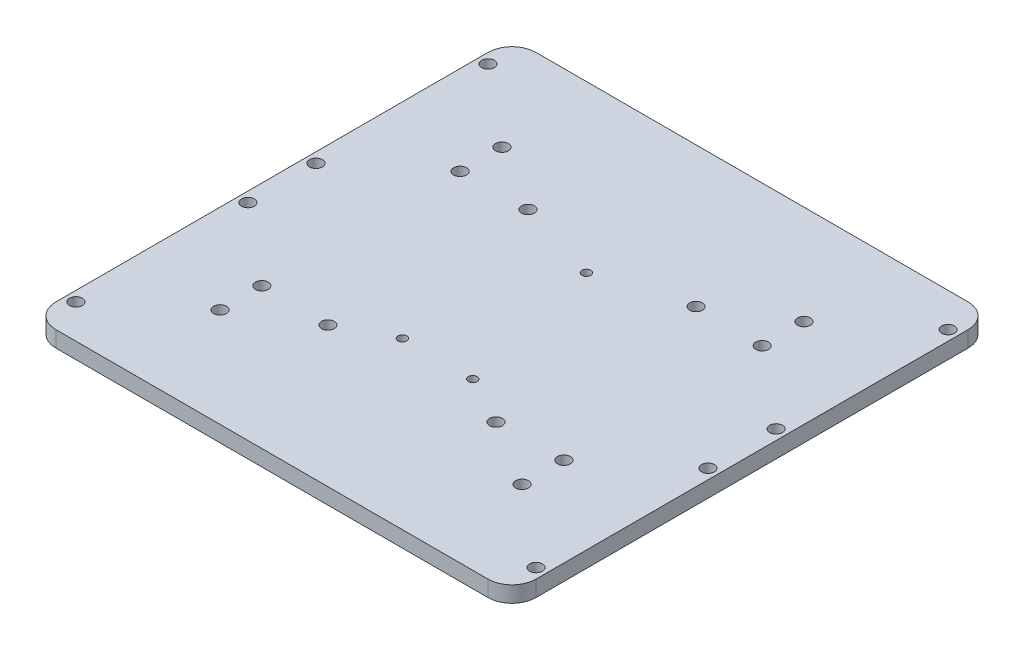
ISO-10303-21;
HEADER;
FILE_DESCRIPTION(('STEP AP214'),'2;1');
FILE_NAME('part.step','',(''),(''),'','','');
FILE_SCHEMA(('AUTOMOTIVE_DESIGN { 1 0 10303 214 1 1 1 1 }'));
ENDSEC;
DATA;
#1=APPLICATION_CONTEXT('core data for automotive mechanical design processes');
#2=APPLICATION_PROTOCOL_DEFINITION('international standard','automotive_design',2000,#1);
#3=PRODUCT_CONTEXT('',#1,'mechanical');
#4=PRODUCT('Part','Part','',(#3));
#5=PRODUCT_RELATED_PRODUCT_CATEGORY('part','',(#4));
#6=PRODUCT_DEFINITION_FORMATION('','',#4);
#7=PRODUCT_DEFINITION_CONTEXT('part definition',#1,'design');
#8=PRODUCT_DEFINITION('design','',#6,#7);
#9=PRODUCT_DEFINITION_SHAPE('','',#8);
#10=(LENGTH_UNIT() NAMED_UNIT(*) SI_UNIT(.MILLI.,.METRE.));
#11=(NAMED_UNIT(*) PLANE_ANGLE_UNIT() SI_UNIT($,.RADIAN.));
#12=(NAMED_UNIT(*) SI_UNIT($,.STERADIAN.) SOLID_ANGLE_UNIT());
#13=UNCERTAINTY_MEASURE_WITH_UNIT(LENGTH_MEASURE(1.E-05),#10,'distance_accuracy_value','');
#14=(GEOMETRIC_REPRESENTATION_CONTEXT(3) GLOBAL_UNCERTAINTY_ASSIGNED_CONTEXT((#13)) GLOBAL_UNIT_ASSIGNED_CONTEXT((#10,
#11,#12)) REPRESENTATION_CONTEXT('',''));
#15=CARTESIAN_POINT('',(0.,0.,0.));
#16=DIRECTION('',(0.,0.,1.));
#17=DIRECTION('',(1.,0.,0.));
#18=AXIS2_PLACEMENT_3D('',#15,#16,#17);
#19=CARTESIAN_POINT('',(-54.,4.,54.));
#20=DIRECTION('',(0.,1.,0.));
#21=DIRECTION('',(0.,0.,1.));
#22=AXIS2_PLACEMENT_3D('',#19,#20,#21);
#23=PLANE('',#22);
#24=CARTESIAN_POINT('',(21.,4.,25.));
#25=DIRECTION('',(0.,1.,0.));
#26=DIRECTION('',(0.,0.,1.));
#27=AXIS2_PLACEMENT_3D('',#24,#25,#26);
#28=CIRCLE('',#27,1.6);
#29=CARTESIAN_POINT('',(21.,4.,26.6));
#30=VERTEX_POINT('',#29);
#31=EDGE_CURVE('E373',#30,#30,#28,.T.);
#32=ORIENTED_EDGE('',*,*,#31,.F.);
#33=EDGE_LOOP('',(#32));
#34=FACE_BOUND('',#33,.T.);
#35=CARTESIAN_POINT('',(-21.,4.,-25.));
#36=DIRECTION('',(0.,1.,0.));
#37=DIRECTION('',(0.,0.,1.));
#38=AXIS2_PLACEMENT_3D('',#35,#36,#37);
#39=CIRCLE('',#38,1.6);
#40=CARTESIAN_POINT('',(-21.,4.,-23.4));
#41=VERTEX_POINT('',#40);
#42=EDGE_CURVE('E357',#41,#41,#39,.T.);
#43=ORIENTED_EDGE('',*,*,#42,.F.);
#44=EDGE_LOOP('',(#43));
#45=FACE_BOUND('',#44,.T.);
#46=CARTESIAN_POINT('',(8.8,4.,18.6));
#47=DIRECTION('',(0.,1.,0.));
#48=DIRECTION('',(0.,0.,1.));
#49=AXIS2_PLACEMENT_3D('',#46,#47,#48);
#50=CIRCLE('',#49,1.1);
#51=CARTESIAN_POINT('',(8.8,4.,19.7));
#52=VERTEX_POINT('',#51);
#53=EDGE_CURVE('E341',#52,#52,#50,.T.);
#54=ORIENTED_EDGE('',*,*,#53,.F.);
#55=EDGE_LOOP('',(#54));
#56=FACE_BOUND('',#55,.T.);
#57=CARTESIAN_POINT('',(57.5,4.,-51.5));
#58=DIRECTION('',(0.,1.,0.));
#59=DIRECTION('',(0.,0.,-1.));
#60=AXIS2_PLACEMENT_3D('',#57,#58,#59);
#61=CIRCLE('',#60,1.6);
#62=CARTESIAN_POINT('',(57.5,4.,-53.1));
#63=VERTEX_POINT('',#62);
#64=EDGE_CURVE('E325',#63,#63,#61,.T.);
#65=ORIENTED_EDGE('',*,*,#64,.F.);
#66=EDGE_LOOP('',(#65));
#67=FACE_BOUND('',#66,.T.);
#68=CARTESIAN_POINT('',(37.75,4.,-24.77));
#69=DIRECTION('',(0.,1.,0.));
#70=DIRECTION('',(0.,0.,1.));
#71=AXIS2_PLACEMENT_3D('',#68,#69,#70);
#72=CIRCLE('',#71,1.6);
#73=CARTESIAN_POINT('',(37.75,4.,-23.17));
#74=VERTEX_POINT('',#73);
#75=EDGE_CURVE('E309',#74,#74,#72,.T.);
#76=ORIENTED_EDGE('',*,*,#75,.F.);
#77=EDGE_LOOP('',(#76));
#78=FACE_BOUND('',#77,.T.);
#79=CARTESIAN_POINT('',(57.5,4.,8.50000000000001));
#80=DIRECTION('',(0.,1.,0.));
#81=DIRECTION('',(0.,0.,-1.));
#82=AXIS2_PLACEMENT_3D('',#79,#80,#81);
#83=CIRCLE('',#82,1.6);
#84=CARTESIAN_POINT('',(57.5,4.,6.90000000000001));
#85=VERTEX_POINT('',#84);
#86=EDGE_CURVE('E293',#85,#85,#83,.T.);
#87=ORIENTED_EDGE('',*,*,#86,.F.);
#88=EDGE_LOOP('',(#87));
#89=FACE_BOUND('',#88,.T.);
#90=CARTESIAN_POINT('',(37.75,4.,35.23));
#91=DIRECTION('',(0.,1.,0.));
#92=DIRECTION('',(0.,0.,1.));
#93=AXIS2_PLACEMENT_3D('',#90,#91,#92);
#94=CIRCLE('',#93,1.6);
#95=CARTESIAN_POINT('',(37.75,4.,36.83));
#96=VERTEX_POINT('',#95);
#97=EDGE_CURVE('E277',#96,#96,#94,.T.);
#98=ORIENTED_EDGE('',*,*,#97,.F.);
#99=EDGE_LOOP('',(#98));
#100=FACE_BOUND('',#99,.T.);
#101=CARTESIAN_POINT('',(-57.5,4.,51.5));
#102=DIRECTION('',(0.,1.,0.));
#103=DIRECTION('',(0.,0.,-1.));
#104=AXIS2_PLACEMENT_3D('',#101,#102,#103);
#105=CIRCLE('',#104,1.6);
#106=CARTESIAN_POINT('',(-57.5,4.,49.9));
#107=VERTEX_POINT('',#106);
#108=EDGE_CURVE('E261',#107,#107,#105,.T.);
#109=ORIENTED_EDGE('',*,*,#108,.F.);
#110=EDGE_LOOP('',(#109));
#111=FACE_BOUND('',#110,.T.);
#112=CARTESIAN_POINT('',(-37.75,4.,24.77));
#113=DIRECTION('',(0.,1.,0.));
#114=DIRECTION('',(0.,0.,1.));
#115=AXIS2_PLACEMENT_3D('',#112,#113,#114);
#116=CIRCLE('',#115,1.6);
#117=CARTESIAN_POINT('',(-37.75,4.,26.37));
#118=VERTEX_POINT('',#117);
#119=EDGE_CURVE('E245',#118,#118,#116,.T.);
#120=ORIENTED_EDGE('',*,*,#119,.F.);
#121=EDGE_LOOP('',(#120));
#122=FACE_BOUND('',#121,.T.);
#123=CARTESIAN_POINT('',(-37.75,4.,-24.77));
#124=DIRECTION('',(0.,1.,0.));
#125=DIRECTION('',(0.,0.,-1.));
#126=AXIS2_PLACEMENT_3D('',#123,#124,#125);
#127=CIRCLE('',#126,1.6);
#128=CARTESIAN_POINT('',(-37.75,4.,-26.37));
#129=VERTEX_POINT('',#128);
#130=EDGE_CURVE('E229',#129,#129,#127,.T.);
#131=ORIENTED_EDGE('',*,*,#130,.F.);
#132=EDGE_LOOP('',(#131));
#133=FACE_BOUND('',#132,.T.);
#134=CARTESIAN_POINT('',(-57.5,4.,-8.49999999999999));
#135=DIRECTION('',(0.,1.,0.));
#136=DIRECTION('',(0.,0.,-1.));
#137=AXIS2_PLACEMENT_3D('',#134,#135,#136);
#138=CIRCLE('',#137,1.6);
#139=CARTESIAN_POINT('',(-57.5,4.,-10.1));
#140=VERTEX_POINT('',#139);
#141=EDGE_CURVE('E213',#140,#140,#138,.T.);
#142=ORIENTED_EDGE('',*,*,#141,.F.);
#143=EDGE_LOOP('',(#142));
#144=FACE_BOUND('',#143,.T.);
#145=CARTESIAN_POINT('',(-54.,4.,54.));
#146=DIRECTION('',(0.,1.,0.));
#147=DIRECTION('',(0.,0.,1.));
#148=AXIS2_PLACEMENT_3D('',#145,#146,#147);
#149=CIRCLE('',#148,6.);
#150=CARTESIAN_POINT('',(-60.,4.,53.9999999999999));
#151=VERTEX_POINT('',#150);
#152=CARTESIAN_POINT('',(-54.,4.,60.));
#153=VERTEX_POINT('',#152);
#154=EDGE_CURVE('E164',#151,#153,#149,.T.);
#155=ORIENTED_EDGE('',*,*,#154,.T.);
#156=DIRECTION('',(1.,0.,0.));
#157=VECTOR('',#156,1.);
#158=CARTESIAN_POINT('',(-54.,4.,60.));
#159=LINE('',#158,#157);
#160=CARTESIAN_POINT('',(54.,4.,60.));
#161=VERTEX_POINT('',#160);
#162=EDGE_CURVE('E100',#153,#161,#159,.T.);
#163=ORIENTED_EDGE('',*,*,#162,.T.);
#164=CARTESIAN_POINT('',(54.,4.,54.));
#165=DIRECTION('',(0.,1.,0.));
#166=DIRECTION('',(0.,0.,1.));
#167=AXIS2_PLACEMENT_3D('',#164,#165,#166);
#168=CIRCLE('',#167,6.);
#169=CARTESIAN_POINT('',(60.,4.,53.9999999999999));
#170=VERTEX_POINT('',#169);
#171=EDGE_CURVE('E185',#161,#170,#168,.T.);
#172=ORIENTED_EDGE('',*,*,#171,.T.);
#173=DIRECTION('',(0.,0.,-1.));
#174=VECTOR('',#173,1.);
#175=CARTESIAN_POINT('',(60.,4.,-54.));
#176=LINE('',#175,#174);
#177=CARTESIAN_POINT('',(60.,4.,-54.));
#178=VERTEX_POINT('',#177);
#179=EDGE_CURVE('E199',#170,#178,#176,.T.);
#180=ORIENTED_EDGE('',*,*,#179,.T.);
#181=CARTESIAN_POINT('',(54.,4.,-54.));
#182=DIRECTION('',(0.,1.,0.));
#183=DIRECTION('',(0.,0.,-1.));
#184=AXIS2_PLACEMENT_3D('',#181,#182,#183);
#185=CIRCLE('',#184,6.);
#186=CARTESIAN_POINT('',(53.9999999999999,4.,-60.));
#187=VERTEX_POINT('',#186);
#188=EDGE_CURVE('E119',#178,#187,#185,.T.);
#189=ORIENTED_EDGE('',*,*,#188,.T.);
#190=DIRECTION('',(-1.,0.,0.));
#191=VECTOR('',#190,1.);
#192=CARTESIAN_POINT('',(-54.,4.,-60.));
#193=LINE('',#192,#191);
#194=CARTESIAN_POINT('',(-54.,4.,-60.));
#195=VERTEX_POINT('',#194);
#196=EDGE_CURVE('E113',#187,#195,#193,.T.);
#197=ORIENTED_EDGE('',*,*,#196,.T.);
#198=CARTESIAN_POINT('',(-54.,4.,-54.));
#199=DIRECTION('',(0.,1.,0.));
#200=DIRECTION('',(0.,0.,1.));
#201=AXIS2_PLACEMENT_3D('',#198,#199,#200);
#202=CIRCLE('',#201,6.);
#203=CARTESIAN_POINT('',(-60.,4.,-54.));
#204=VERTEX_POINT('',#203);
#205=EDGE_CURVE('E117',#195,#204,#202,.T.);
#206=ORIENTED_EDGE('',*,*,#205,.T.);
#207=DIRECTION('',(0.,0.,1.));
#208=VECTOR('',#207,1.);
#209=CARTESIAN_POINT('',(-60.,4.,-54.));
#210=LINE('',#209,#208);
#211=EDGE_CURVE('E57',#204,#151,#210,.T.);
#212=ORIENTED_EDGE('',*,*,#211,.T.);
#213=EDGE_LOOP('',(#155,#163,#172,#180,#189,#197,#206,#212));
#214=FACE_BOUND('',#213,.T.);
#215=CARTESIAN_POINT('',(-57.5,4.,-51.5));
#216=DIRECTION('',(0.,1.,0.));
#217=DIRECTION('',(0.,0.,1.));
#218=AXIS2_PLACEMENT_3D('',#215,#216,#217);
#219=CIRCLE('',#218,1.6);
#220=CARTESIAN_POINT('',(-57.5,4.,-49.9));
#221=VERTEX_POINT('',#220);
#222=EDGE_CURVE('E146',#221,#221,#219,.T.);
#223=ORIENTED_EDGE('',*,*,#222,.F.);
#224=EDGE_LOOP('',(#223));
#225=FACE_BOUND('',#224,.T.);
#226=CARTESIAN_POINT('',(-37.75,4.,-35.23));
#227=DIRECTION('',(0.,1.,0.));
#228=DIRECTION('',(0.,0.,1.));
#229=AXIS2_PLACEMENT_3D('',#226,#227,#228);
#230=CIRCLE('',#229,1.6);
#231=CARTESIAN_POINT('',(-37.75,4.,-33.63));
#232=VERTEX_POINT('',#231);
#233=EDGE_CURVE('E221',#232,#232,#230,.T.);
#234=ORIENTED_EDGE('',*,*,#233,.F.);
#235=EDGE_LOOP('',(#234));
#236=FACE_BOUND('',#235,.T.);
#237=CARTESIAN_POINT('',(-57.5,4.,8.50000000000001));
#238=DIRECTION('',(0.,1.,0.));
#239=DIRECTION('',(0.,0.,1.));
#240=AXIS2_PLACEMENT_3D('',#237,#238,#239);
#241=CIRCLE('',#240,1.6);
#242=CARTESIAN_POINT('',(-57.5,4.,10.1));
#243=VERTEX_POINT('',#242);
#244=EDGE_CURVE('E237',#243,#243,#241,.T.);
#245=ORIENTED_EDGE('',*,*,#244,.F.);
#246=EDGE_LOOP('',(#245));
#247=FACE_BOUND('',#246,.T.);
#248=CARTESIAN_POINT('',(-37.75,4.,35.23));
#249=DIRECTION('',(0.,1.,0.));
#250=DIRECTION('',(0.,0.,-1.));
#251=AXIS2_PLACEMENT_3D('',#248,#249,#250);
#252=CIRCLE('',#251,1.6);
#253=CARTESIAN_POINT('',(-37.75,4.,33.63));
#254=VERTEX_POINT('',#253);
#255=EDGE_CURVE('E253',#254,#254,#252,.T.);
#256=ORIENTED_EDGE('',*,*,#255,.F.);
#257=EDGE_LOOP('',(#256));
#258=FACE_BOUND('',#257,.T.);
#259=CARTESIAN_POINT('',(57.5,4.,51.5));
#260=DIRECTION('',(0.,1.,0.));
#261=DIRECTION('',(0.,0.,1.));
#262=AXIS2_PLACEMENT_3D('',#259,#260,#261);
#263=CIRCLE('',#262,1.6);
#264=CARTESIAN_POINT('',(57.5,4.,53.1));
#265=VERTEX_POINT('',#264);
#266=EDGE_CURVE('E269',#265,#265,#263,.T.);
#267=ORIENTED_EDGE('',*,*,#266,.F.);
#268=EDGE_LOOP('',(#267));
#269=FACE_BOUND('',#268,.T.);
#270=CARTESIAN_POINT('',(37.75,4.,24.77));
#271=DIRECTION('',(0.,1.,0.));
#272=DIRECTION('',(0.,0.,-1.));
#273=AXIS2_PLACEMENT_3D('',#270,#271,#272);
#274=CIRCLE('',#273,1.6);
#275=CARTESIAN_POINT('',(37.75,4.,23.17));
#276=VERTEX_POINT('',#275);
#277=EDGE_CURVE('E285',#276,#276,#274,.T.);
#278=ORIENTED_EDGE('',*,*,#277,.F.);
#279=EDGE_LOOP('',(#278));
#280=FACE_BOUND('',#279,.T.);
#281=CARTESIAN_POINT('',(57.5,4.,-8.50000000000002));
#282=DIRECTION('',(0.,1.,0.));
#283=DIRECTION('',(0.,0.,1.));
#284=AXIS2_PLACEMENT_3D('',#281,#282,#283);
#285=CIRCLE('',#284,1.6);
#286=CARTESIAN_POINT('',(57.5,4.,-6.90000000000002));
#287=VERTEX_POINT('',#286);
#288=EDGE_CURVE('E301',#287,#287,#285,.T.);
#289=ORIENTED_EDGE('',*,*,#288,.F.);
#290=EDGE_LOOP('',(#289));
#291=FACE_BOUND('',#290,.T.);
#292=CARTESIAN_POINT('',(37.75,4.,-35.23));
#293=DIRECTION('',(0.,1.,0.));
#294=DIRECTION('',(0.,0.,-1.));
#295=AXIS2_PLACEMENT_3D('',#292,#293,#294);
#296=CIRCLE('',#295,1.6);
#297=CARTESIAN_POINT('',(37.75,4.,-36.83));
#298=VERTEX_POINT('',#297);
#299=EDGE_CURVE('E317',#298,#298,#296,.T.);
#300=ORIENTED_EDGE('',*,*,#299,.F.);
#301=EDGE_LOOP('',(#300));
#302=FACE_BOUND('',#301,.T.);
#303=CARTESIAN_POINT('',(0.,4.,-18.6));
#304=DIRECTION('',(0.,1.,0.));
#305=DIRECTION('',(0.,0.,1.));
#306=AXIS2_PLACEMENT_3D('',#303,#304,#305);
#307=CIRCLE('',#306,1.1);
#308=CARTESIAN_POINT('',(0.,4.,-17.5));
#309=VERTEX_POINT('',#308);
#310=EDGE_CURVE('E333',#309,#309,#307,.T.);
#311=ORIENTED_EDGE('',*,*,#310,.F.);
#312=EDGE_LOOP('',(#311));
#313=FACE_BOUND('',#312,.T.);
#314=CARTESIAN_POINT('',(-8.8,4.,18.6));
#315=DIRECTION('',(0.,1.,0.));
#316=DIRECTION('',(0.,0.,1.));
#317=AXIS2_PLACEMENT_3D('',#314,#315,#316);
#318=CIRCLE('',#317,1.1);
#319=CARTESIAN_POINT('',(-8.8,4.,19.7));
#320=VERTEX_POINT('',#319);
#321=EDGE_CURVE('E349',#320,#320,#318,.T.);
#322=ORIENTED_EDGE('',*,*,#321,.F.);
#323=EDGE_LOOP('',(#322));
#324=FACE_BOUND('',#323,.T.);
#325=CARTESIAN_POINT('',(21.,4.,-25.));
#326=DIRECTION('',(0.,1.,0.));
#327=DIRECTION('',(0.,0.,-1.));
#328=AXIS2_PLACEMENT_3D('',#325,#326,#327);
#329=CIRCLE('',#328,1.6);
#330=CARTESIAN_POINT('',(21.,4.,-26.6));
#331=VERTEX_POINT('',#330);
#332=EDGE_CURVE('E365',#331,#331,#329,.T.);
#333=ORIENTED_EDGE('',*,*,#332,.F.);
#334=EDGE_LOOP('',(#333));
#335=FACE_BOUND('',#334,.T.);
#336=CARTESIAN_POINT('',(-21.,4.,25.));
#337=DIRECTION('',(0.,1.,0.));
#338=DIRECTION('',(0.,0.,-1.));
#339=AXIS2_PLACEMENT_3D('',#336,#337,#338);
#340=CIRCLE('',#339,1.6);
#341=CARTESIAN_POINT('',(-21.,4.,23.4));
#342=VERTEX_POINT('',#341);
#343=EDGE_CURVE('E381',#342,#342,#340,.T.);
#344=ORIENTED_EDGE('',*,*,#343,.F.);
#345=EDGE_LOOP('',(#344));
#346=FACE_BOUND('',#345,.T.);
#347=ADVANCED_FACE('F39',(#34,#45,#56,#67,#78,#89,#100,#111,#122,#133,#144,#214,#225,#236,#247,
#258,#269,#280,#291,#302,#313,#324,#335,#346),#23,.T.);
#348=CARTESIAN_POINT('',(-54.,0.,54.));
#349=DIRECTION('',(0.,1.,0.));
#350=DIRECTION('',(0.,0.,1.));
#351=AXIS2_PLACEMENT_3D('',#348,#349,#350);
#352=PLANE('',#351);
#353=CARTESIAN_POINT('',(-54.,0.,54.));
#354=DIRECTION('',(0.,1.,0.));
#355=DIRECTION('',(0.,0.,1.));
#356=AXIS2_PLACEMENT_3D('',#353,#354,#355);
#357=CIRCLE('',#356,6.);
#358=CARTESIAN_POINT('',(-60.,0.,53.9999999999999));
#359=VERTEX_POINT('',#358);
#360=CARTESIAN_POINT('',(-54.,0.,60.));
#361=VERTEX_POINT('',#360);
#362=EDGE_CURVE('E141',#359,#361,#357,.T.);
#363=ORIENTED_EDGE('',*,*,#362,.F.);
#364=DIRECTION('',(0.,0.,1.));
#365=VECTOR('',#364,1.);
#366=CARTESIAN_POINT('',(-60.,0.,-54.));
#367=LINE('',#366,#365);
#368=CARTESIAN_POINT('',(-60.,0.,-54.));
#369=VERTEX_POINT('',#368);
#370=EDGE_CURVE('E92',#369,#359,#367,.T.);
#371=ORIENTED_EDGE('',*,*,#370,.F.);
#372=CARTESIAN_POINT('',(-54.,0.,-54.));
#373=DIRECTION('',(0.,1.,0.));
#374=DIRECTION('',(0.,0.,1.));
#375=AXIS2_PLACEMENT_3D('',#372,#373,#374);
#376=CIRCLE('',#375,6.);
#377=CARTESIAN_POINT('',(-54.,0.,-60.));
#378=VERTEX_POINT('',#377);
#379=EDGE_CURVE('E86',#378,#369,#376,.T.);
#380=ORIENTED_EDGE('',*,*,#379,.F.);
#381=DIRECTION('',(-1.,0.,0.));
#382=VECTOR('',#381,1.);
#383=CARTESIAN_POINT('',(-54.,0.,-60.));
#384=LINE('',#383,#382);
#385=CARTESIAN_POINT('',(53.9999999999999,0.,-60.));
#386=VERTEX_POINT('',#385);
#387=EDGE_CURVE('E128',#386,#378,#384,.T.);
#388=ORIENTED_EDGE('',*,*,#387,.F.);
#389=CARTESIAN_POINT('',(54.,0.,-54.));
#390=DIRECTION('',(0.,1.,0.));
#391=DIRECTION('',(0.,0.,-1.));
#392=AXIS2_PLACEMENT_3D('',#389,#390,#391);
#393=CIRCLE('',#392,6.);
#394=CARTESIAN_POINT('',(60.,0.,-54.));
#395=VERTEX_POINT('',#394);
#396=EDGE_CURVE('E155',#395,#386,#393,.T.);
#397=ORIENTED_EDGE('',*,*,#396,.F.);
#398=DIRECTION('',(0.,0.,-1.));
#399=VECTOR('',#398,1.);
#400=CARTESIAN_POINT('',(60.,0.,-54.));
#401=LINE('',#400,#399);
#402=CARTESIAN_POINT('',(60.,0.,53.9999999999999));
#403=VERTEX_POINT('',#402);
#404=EDGE_CURVE('E152',#403,#395,#401,.T.);
#405=ORIENTED_EDGE('',*,*,#404,.F.);
#406=CARTESIAN_POINT('',(54.,0.,54.));
#407=DIRECTION('',(0.,1.,0.));
#408=DIRECTION('',(0.,0.,1.));
#409=AXIS2_PLACEMENT_3D('',#406,#407,#408);
#410=CIRCLE('',#409,6.);
#411=CARTESIAN_POINT('',(54.,0.,60.));
#412=VERTEX_POINT('',#411);
#413=EDGE_CURVE('E149',#412,#403,#410,.T.);
#414=ORIENTED_EDGE('',*,*,#413,.F.);
#415=DIRECTION('',(1.,0.,0.));
#416=VECTOR('',#415,1.);
#417=CARTESIAN_POINT('',(-54.,0.,60.));
#418=LINE('',#417,#416);
#419=EDGE_CURVE('E145',#361,#412,#418,.T.);
#420=ORIENTED_EDGE('',*,*,#419,.F.);
#421=EDGE_LOOP('',(#363,#371,#380,#388,#397,#405,#414,#420));
#422=FACE_BOUND('',#421,.T.);
#423=CARTESIAN_POINT('',(-57.5,0.,-51.5));
#424=DIRECTION('',(0.,1.,0.));
#425=DIRECTION('',(0.,0.,1.));
#426=AXIS2_PLACEMENT_3D('',#423,#424,#425);
#427=CIRCLE('',#426,1.6);
#428=CARTESIAN_POINT('',(-57.5,0.,-49.9));
#429=VERTEX_POINT('',#428);
#430=EDGE_CURVE('E209',#429,#429,#427,.T.);
#431=ORIENTED_EDGE('',*,*,#430,.T.);
#432=EDGE_LOOP('',(#431));
#433=FACE_BOUND('',#432,.T.);
#434=CARTESIAN_POINT('',(-57.5,0.,-8.49999999999999));
#435=DIRECTION('',(0.,1.,0.));
#436=DIRECTION('',(0.,0.,-1.));
#437=AXIS2_PLACEMENT_3D('',#434,#435,#436);
#438=CIRCLE('',#437,1.6);
#439=CARTESIAN_POINT('',(-57.5,0.,-10.1));
#440=VERTEX_POINT('',#439);
#441=EDGE_CURVE('E217',#440,#440,#438,.T.);
#442=ORIENTED_EDGE('',*,*,#441,.T.);
#443=EDGE_LOOP('',(#442));
#444=FACE_BOUND('',#443,.T.);
#445=CARTESIAN_POINT('',(-37.75,0.,-35.23));
#446=DIRECTION('',(0.,1.,0.));
#447=DIRECTION('',(0.,0.,1.));
#448=AXIS2_PLACEMENT_3D('',#445,#446,#447);
#449=CIRCLE('',#448,1.6);
#450=CARTESIAN_POINT('',(-37.75,0.,-33.63));
#451=VERTEX_POINT('',#450);
#452=EDGE_CURVE('E225',#451,#451,#449,.T.);
#453=ORIENTED_EDGE('',*,*,#452,.T.);
#454=EDGE_LOOP('',(#453));
#455=FACE_BOUND('',#454,.T.);
#456=CARTESIAN_POINT('',(-37.75,0.,-24.77));
#457=DIRECTION('',(0.,1.,0.));
#458=DIRECTION('',(0.,0.,-1.));
#459=AXIS2_PLACEMENT_3D('',#456,#457,#458);
#460=CIRCLE('',#459,1.6);
#461=CARTESIAN_POINT('',(-37.75,0.,-26.37));
#462=VERTEX_POINT('',#461);
#463=EDGE_CURVE('E233',#462,#462,#460,.T.);
#464=ORIENTED_EDGE('',*,*,#463,.T.);
#465=EDGE_LOOP('',(#464));
#466=FACE_BOUND('',#465,.T.);
#467=CARTESIAN_POINT('',(-57.5,0.,8.50000000000001));
#468=DIRECTION('',(0.,1.,0.));
#469=DIRECTION('',(0.,0.,1.));
#470=AXIS2_PLACEMENT_3D('',#467,#468,#469);
#471=CIRCLE('',#470,1.6);
#472=CARTESIAN_POINT('',(-57.5,0.,10.1));
#473=VERTEX_POINT('',#472);
#474=EDGE_CURVE('E241',#473,#473,#471,.T.);
#475=ORIENTED_EDGE('',*,*,#474,.T.);
#476=EDGE_LOOP('',(#475));
#477=FACE_BOUND('',#476,.T.);
#478=CARTESIAN_POINT('',(-37.75,0.,24.77));
#479=DIRECTION('',(0.,1.,0.));
#480=DIRECTION('',(0.,0.,1.));
#481=AXIS2_PLACEMENT_3D('',#478,#479,#480);
#482=CIRCLE('',#481,1.6);
#483=CARTESIAN_POINT('',(-37.75,0.,26.37));
#484=VERTEX_POINT('',#483);
#485=EDGE_CURVE('E249',#484,#484,#482,.T.);
#486=ORIENTED_EDGE('',*,*,#485,.T.);
#487=EDGE_LOOP('',(#486));
#488=FACE_BOUND('',#487,.T.);
#489=CARTESIAN_POINT('',(-37.75,0.,35.23));
#490=DIRECTION('',(0.,1.,0.));
#491=DIRECTION('',(0.,0.,-1.));
#492=AXIS2_PLACEMENT_3D('',#489,#490,#491);
#493=CIRCLE('',#492,1.6);
#494=CARTESIAN_POINT('',(-37.75,0.,33.63));
#495=VERTEX_POINT('',#494);
#496=EDGE_CURVE('E257',#495,#495,#493,.T.);
#497=ORIENTED_EDGE('',*,*,#496,.T.);
#498=EDGE_LOOP('',(#497));
#499=FACE_BOUND('',#498,.T.);
#500=CARTESIAN_POINT('',(-57.5,0.,51.5));
#501=DIRECTION('',(0.,1.,0.));
#502=DIRECTION('',(0.,0.,-1.));
#503=AXIS2_PLACEMENT_3D('',#500,#501,#502);
#504=CIRCLE('',#503,1.6);
#505=CARTESIAN_POINT('',(-57.5,0.,49.9));
#506=VERTEX_POINT('',#505);
#507=EDGE_CURVE('E265',#506,#506,#504,.T.);
#508=ORIENTED_EDGE('',*,*,#507,.T.);
#509=EDGE_LOOP('',(#508));
#510=FACE_BOUND('',#509,.T.);
#511=CARTESIAN_POINT('',(57.5,0.,51.5));
#512=DIRECTION('',(0.,1.,0.));
#513=DIRECTION('',(0.,0.,1.));
#514=AXIS2_PLACEMENT_3D('',#511,#512,#513);
#515=CIRCLE('',#514,1.6);
#516=CARTESIAN_POINT('',(57.5,0.,53.1));
#517=VERTEX_POINT('',#516);
#518=EDGE_CURVE('E273',#517,#517,#515,.T.);
#519=ORIENTED_EDGE('',*,*,#518,.T.);
#520=EDGE_LOOP('',(#519));
#521=FACE_BOUND('',#520,.T.);
#522=CARTESIAN_POINT('',(37.75,0.,35.23));
#523=DIRECTION('',(0.,1.,0.));
#524=DIRECTION('',(0.,0.,1.));
#525=AXIS2_PLACEMENT_3D('',#522,#523,#524);
#526=CIRCLE('',#525,1.6);
#527=CARTESIAN_POINT('',(37.75,0.,36.83));
#528=VERTEX_POINT('',#527);
#529=EDGE_CURVE('E281',#528,#528,#526,.T.);
#530=ORIENTED_EDGE('',*,*,#529,.T.);
#531=EDGE_LOOP('',(#530));
#532=FACE_BOUND('',#531,.T.);
#533=CARTESIAN_POINT('',(37.75,0.,24.77));
#534=DIRECTION('',(0.,1.,0.));
#535=DIRECTION('',(0.,0.,-1.));
#536=AXIS2_PLACEMENT_3D('',#533,#534,#535);
#537=CIRCLE('',#536,1.6);
#538=CARTESIAN_POINT('',(37.75,0.,23.17));
#539=VERTEX_POINT('',#538);
#540=EDGE_CURVE('E289',#539,#539,#537,.T.);
#541=ORIENTED_EDGE('',*,*,#540,.T.);
#542=EDGE_LOOP('',(#541));
#543=FACE_BOUND('',#542,.T.);
#544=CARTESIAN_POINT('',(57.5,0.,8.50000000000001));
#545=DIRECTION('',(0.,1.,0.));
#546=DIRECTION('',(0.,0.,-1.));
#547=AXIS2_PLACEMENT_3D('',#544,#545,#546);
#548=CIRCLE('',#547,1.6);
#549=CARTESIAN_POINT('',(57.5,0.,6.90000000000001));
#550=VERTEX_POINT('',#549);
#551=EDGE_CURVE('E297',#550,#550,#548,.T.);
#552=ORIENTED_EDGE('',*,*,#551,.T.);
#553=EDGE_LOOP('',(#552));
#554=FACE_BOUND('',#553,.T.);
#555=CARTESIAN_POINT('',(57.5,0.,-8.50000000000002));
#556=DIRECTION('',(0.,1.,0.));
#557=DIRECTION('',(0.,0.,1.));
#558=AXIS2_PLACEMENT_3D('',#555,#556,#557);
#559=CIRCLE('',#558,1.6);
#560=CARTESIAN_POINT('',(57.5,0.,-6.90000000000002));
#561=VERTEX_POINT('',#560);
#562=EDGE_CURVE('E305',#561,#561,#559,.T.);
#563=ORIENTED_EDGE('',*,*,#562,.T.);
#564=EDGE_LOOP('',(#563));
#565=FACE_BOUND('',#564,.T.);
#566=CARTESIAN_POINT('',(37.75,0.,-24.77));
#567=DIRECTION('',(0.,1.,0.));
#568=DIRECTION('',(0.,0.,1.));
#569=AXIS2_PLACEMENT_3D('',#566,#567,#568);
#570=CIRCLE('',#569,1.6);
#571=CARTESIAN_POINT('',(37.75,0.,-23.17));
#572=VERTEX_POINT('',#571);
#573=EDGE_CURVE('E313',#572,#572,#570,.T.);
#574=ORIENTED_EDGE('',*,*,#573,.T.);
#575=EDGE_LOOP('',(#574));
#576=FACE_BOUND('',#575,.T.);
#577=CARTESIAN_POINT('',(37.75,0.,-35.23));
#578=DIRECTION('',(0.,1.,0.));
#579=DIRECTION('',(0.,0.,-1.));
#580=AXIS2_PLACEMENT_3D('',#577,#578,#579);
#581=CIRCLE('',#580,1.6);
#582=CARTESIAN_POINT('',(37.75,0.,-36.83));
#583=VERTEX_POINT('',#582);
#584=EDGE_CURVE('E321',#583,#583,#581,.T.);
#585=ORIENTED_EDGE('',*,*,#584,.T.);
#586=EDGE_LOOP('',(#585));
#587=FACE_BOUND('',#586,.T.);
#588=CARTESIAN_POINT('',(57.5,0.,-51.5));
#589=DIRECTION('',(0.,1.,0.));
#590=DIRECTION('',(0.,0.,-1.));
#591=AXIS2_PLACEMENT_3D('',#588,#589,#590);
#592=CIRCLE('',#591,1.6);
#593=CARTESIAN_POINT('',(57.5,0.,-53.1));
#594=VERTEX_POINT('',#593);
#595=EDGE_CURVE('E329',#594,#594,#592,.T.);
#596=ORIENTED_EDGE('',*,*,#595,.T.);
#597=EDGE_LOOP('',(#596));
#598=FACE_BOUND('',#597,.T.);
#599=CARTESIAN_POINT('',(0.,0.,-18.6));
#600=DIRECTION('',(0.,1.,0.));
#601=DIRECTION('',(0.,0.,1.));
#602=AXIS2_PLACEMENT_3D('',#599,#600,#601);
#603=CIRCLE('',#602,1.1);
#604=CARTESIAN_POINT('',(0.,0.,-17.5));
#605=VERTEX_POINT('',#604);
#606=EDGE_CURVE('E337',#605,#605,#603,.T.);
#607=ORIENTED_EDGE('',*,*,#606,.T.);
#608=EDGE_LOOP('',(#607));
#609=FACE_BOUND('',#608,.T.);
#610=CARTESIAN_POINT('',(8.8,0.,18.6));
#611=DIRECTION('',(0.,1.,0.));
#612=DIRECTION('',(0.,0.,1.));
#613=AXIS2_PLACEMENT_3D('',#610,#611,#612);
#614=CIRCLE('',#613,1.1);
#615=CARTESIAN_POINT('',(8.8,0.,19.7));
#616=VERTEX_POINT('',#615);
#617=EDGE_CURVE('E345',#616,#616,#614,.T.);
#618=ORIENTED_EDGE('',*,*,#617,.T.);
#619=EDGE_LOOP('',(#618));
#620=FACE_BOUND('',#619,.T.);
#621=CARTESIAN_POINT('',(-8.8,0.,18.6));
#622=DIRECTION('',(0.,1.,0.));
#623=DIRECTION('',(0.,0.,1.));
#624=AXIS2_PLACEMENT_3D('',#621,#622,#623);
#625=CIRCLE('',#624,1.1);
#626=CARTESIAN_POINT('',(-8.8,0.,19.7));
#627=VERTEX_POINT('',#626);
#628=EDGE_CURVE('E353',#627,#627,#625,.T.);
#629=ORIENTED_EDGE('',*,*,#628,.T.);
#630=EDGE_LOOP('',(#629));
#631=FACE_BOUND('',#630,.T.);
#632=CARTESIAN_POINT('',(-21.,0.,-25.));
#633=DIRECTION('',(0.,1.,0.));
#634=DIRECTION('',(0.,0.,1.));
#635=AXIS2_PLACEMENT_3D('',#632,#633,#634);
#636=CIRCLE('',#635,1.6);
#637=CARTESIAN_POINT('',(-21.,0.,-23.4));
#638=VERTEX_POINT('',#637);
#639=EDGE_CURVE('E361',#638,#638,#636,.T.);
#640=ORIENTED_EDGE('',*,*,#639,.T.);
#641=EDGE_LOOP('',(#640));
#642=FACE_BOUND('',#641,.T.);
#643=CARTESIAN_POINT('',(21.,0.,-25.));
#644=DIRECTION('',(0.,1.,0.));
#645=DIRECTION('',(0.,0.,-1.));
#646=AXIS2_PLACEMENT_3D('',#643,#644,#645);
#647=CIRCLE('',#646,1.6);
#648=CARTESIAN_POINT('',(21.,0.,-26.6));
#649=VERTEX_POINT('',#648);
#650=EDGE_CURVE('E369',#649,#649,#647,.T.);
#651=ORIENTED_EDGE('',*,*,#650,.T.);
#652=EDGE_LOOP('',(#651));
#653=FACE_BOUND('',#652,.T.);
#654=CARTESIAN_POINT('',(21.,0.,25.));
#655=DIRECTION('',(0.,1.,0.));
#656=DIRECTION('',(0.,0.,1.));
#657=AXIS2_PLACEMENT_3D('',#654,#655,#656);
#658=CIRCLE('',#657,1.6);
#659=CARTESIAN_POINT('',(21.,0.,26.6));
#660=VERTEX_POINT('',#659);
#661=EDGE_CURVE('E377',#660,#660,#658,.T.);
#662=ORIENTED_EDGE('',*,*,#661,.T.);
#663=EDGE_LOOP('',(#662));
#664=FACE_BOUND('',#663,.T.);
#665=CARTESIAN_POINT('',(-21.,0.,25.));
#666=DIRECTION('',(0.,1.,0.));
#667=DIRECTION('',(0.,0.,-1.));
#668=AXIS2_PLACEMENT_3D('',#665,#666,#667);
#669=CIRCLE('',#668,1.6);
#670=CARTESIAN_POINT('',(-21.,0.,23.4));
#671=VERTEX_POINT('',#670);
#672=EDGE_CURVE('E385',#671,#671,#669,.T.);
#673=ORIENTED_EDGE('',*,*,#672,.T.);
#674=EDGE_LOOP('',(#673));
#675=FACE_BOUND('',#674,.T.);
#676=ADVANCED_FACE('F189',(#422,#433,#444,#455,#466,#477,#488,#499,#510,#521,#532,#543,#554,
#565,#576,#587,#598,#609,#620,#631,#642,#653,#664,#675),#352,.F.);
#677=CARTESIAN_POINT('',(-54.,4.,54.));
#678=DIRECTION('',(0.,-1.,0.));
#679=DIRECTION('',(0.,0.,-1.));
#680=AXIS2_PLACEMENT_3D('',#677,#678,#679);
#681=CYLINDRICAL_SURFACE('',#680,6.);
#682=ORIENTED_EDGE('',*,*,#362,.T.);
#683=DIRECTION('',(0.,-1.,0.));
#684=VECTOR('',#683,1.);
#685=CARTESIAN_POINT('',(-54.,4.,60.));
#686=LINE('',#685,#684);
#687=EDGE_CURVE('E11',#153,#361,#686,.T.);
#688=ORIENTED_EDGE('',*,*,#687,.F.);
#689=ORIENTED_EDGE('',*,*,#154,.F.);
#690=DIRECTION('',(0.,-1.,0.));
#691=VECTOR('',#690,1.);
#692=CARTESIAN_POINT('',(-60.,4.,53.9999999999999));
#693=LINE('',#692,#691);
#694=EDGE_CURVE('E137',#151,#359,#693,.T.);
#695=ORIENTED_EDGE('',*,*,#694,.T.);
#696=EDGE_LOOP('',(#682,#688,#689,#695));
#697=FACE_BOUND('',#696,.T.);
#698=ADVANCED_FACE('F41',(#697),#681,.T.);
#699=CARTESIAN_POINT('',(-54.,4.,60.));
#700=DIRECTION('',(0.,0.,-1.));
#701=DIRECTION('',(-1.,0.,0.));
#702=AXIS2_PLACEMENT_3D('',#699,#700,#701);
#703=PLANE('',#702);
#704=ORIENTED_EDGE('',*,*,#419,.T.);
#705=DIRECTION('',(0.,-1.,0.));
#706=VECTOR('',#705,1.);
#707=CARTESIAN_POINT('',(54.,4.,60.));
#708=LINE('',#707,#706);
#709=EDGE_CURVE('E49',#161,#412,#708,.T.);
#710=ORIENTED_EDGE('',*,*,#709,.F.);
#711=ORIENTED_EDGE('',*,*,#162,.F.);
#712=ORIENTED_EDGE('',*,*,#687,.T.);
#713=EDGE_LOOP('',(#704,#710,#711,#712));
#714=FACE_BOUND('',#713,.T.);
#715=ADVANCED_FACE('F421',(#714),#703,.F.);
#716=CARTESIAN_POINT('',(54.,4.,54.));
#717=DIRECTION('',(0.,-1.,0.));
#718=DIRECTION('',(0.,0.,-1.));
#719=AXIS2_PLACEMENT_3D('',#716,#717,#718);
#720=CYLINDRICAL_SURFACE('',#719,6.);
#721=ORIENTED_EDGE('',*,*,#413,.T.);
#722=DIRECTION('',(0.,-1.,0.));
#723=VECTOR('',#722,1.);
#724=CARTESIAN_POINT('',(60.,4.,53.9999999999999));
#725=LINE('',#724,#723);
#726=EDGE_CURVE('E175',#170,#403,#725,.T.);
#727=ORIENTED_EDGE('',*,*,#726,.F.);
#728=ORIENTED_EDGE('',*,*,#171,.F.);
#729=ORIENTED_EDGE('',*,*,#709,.T.);
#730=EDGE_LOOP('',(#721,#727,#728,#729));
#731=FACE_BOUND('',#730,.T.);
#732=ADVANCED_FACE('F183',(#731),#720,.T.);
#733=CARTESIAN_POINT('',(60.,4.,-54.));
#734=DIRECTION('',(-1.,0.,0.));
#735=DIRECTION('',(0.,0.,1.));
#736=AXIS2_PLACEMENT_3D('',#733,#734,#735);
#737=PLANE('',#736);
#738=ORIENTED_EDGE('',*,*,#404,.T.);
#739=DIRECTION('',(0.,-1.,0.));
#740=VECTOR('',#739,1.);
#741=CARTESIAN_POINT('',(60.,4.,-54.));
#742=LINE('',#741,#740);
#743=EDGE_CURVE('E171',#178,#395,#742,.T.);
#744=ORIENTED_EDGE('',*,*,#743,.F.);
#745=ORIENTED_EDGE('',*,*,#179,.F.);
#746=ORIENTED_EDGE('',*,*,#726,.T.);
#747=EDGE_LOOP('',(#738,#744,#745,#746));
#748=FACE_BOUND('',#747,.T.);
#749=ADVANCED_FACE('F194',(#748),#737,.F.);
#750=CARTESIAN_POINT('',(54.,4.,-54.));
#751=DIRECTION('',(0.,-1.,0.));
#752=DIRECTION('',(0.,0.,-1.));
#753=AXIS2_PLACEMENT_3D('',#750,#751,#752);
#754=CYLINDRICAL_SURFACE('',#753,6.);
#755=ORIENTED_EDGE('',*,*,#396,.T.);
#756=DIRECTION('',(0.,-1.,0.));
#757=VECTOR('',#756,1.);
#758=CARTESIAN_POINT('',(53.9999999999999,4.,-60.));
#759=LINE('',#758,#757);
#760=EDGE_CURVE('E130',#187,#386,#759,.T.);
#761=ORIENTED_EDGE('',*,*,#760,.F.);
#762=ORIENTED_EDGE('',*,*,#188,.F.);
#763=ORIENTED_EDGE('',*,*,#743,.T.);
#764=EDGE_LOOP('',(#755,#761,#762,#763));
#765=FACE_BOUND('',#764,.T.);
#766=ADVANCED_FACE('F197',(#765),#754,.T.);
#767=CARTESIAN_POINT('',(-54.,4.,-60.));
#768=DIRECTION('',(0.,0.,1.));
#769=DIRECTION('',(1.,0.,0.));
#770=AXIS2_PLACEMENT_3D('',#767,#768,#769);
#771=PLANE('',#770);
#772=ORIENTED_EDGE('',*,*,#387,.T.);
#773=DIRECTION('',(0.,-1.,0.));
#774=VECTOR('',#773,1.);
#775=CARTESIAN_POINT('',(-54.,4.,-60.));
#776=LINE('',#775,#774);
#777=EDGE_CURVE('E125',#195,#378,#776,.T.);
#778=ORIENTED_EDGE('',*,*,#777,.F.);
#779=ORIENTED_EDGE('',*,*,#196,.F.);
#780=ORIENTED_EDGE('',*,*,#760,.T.);
#781=EDGE_LOOP('',(#772,#778,#779,#780));
#782=FACE_BOUND('',#781,.T.);
#783=ADVANCED_FACE('F126',(#782),#771,.F.);
#784=CARTESIAN_POINT('',(-54.,4.,-54.));
#785=DIRECTION('',(0.,-1.,0.));
#786=DIRECTION('',(0.,0.,-1.));
#787=AXIS2_PLACEMENT_3D('',#784,#785,#786);
#788=CYLINDRICAL_SURFACE('',#787,6.);
#789=ORIENTED_EDGE('',*,*,#379,.T.);
#790=DIRECTION('',(0.,-1.,0.));
#791=VECTOR('',#790,1.);
#792=CARTESIAN_POINT('',(-60.,4.,-54.));
#793=LINE('',#792,#791);
#794=EDGE_CURVE('E131',#204,#369,#793,.T.);
#795=ORIENTED_EDGE('',*,*,#794,.F.);
#796=ORIENTED_EDGE('',*,*,#205,.F.);
#797=ORIENTED_EDGE('',*,*,#777,.T.);
#798=EDGE_LOOP('',(#789,#795,#796,#797));
#799=FACE_BOUND('',#798,.T.);
#800=ADVANCED_FACE('F133',(#799),#788,.T.);
#801=CARTESIAN_POINT('',(-60.,4.,-54.));
#802=DIRECTION('',(1.,0.,0.));
#803=DIRECTION('',(0.,0.,-1.));
#804=AXIS2_PLACEMENT_3D('',#801,#802,#803);
#805=PLANE('',#804);
#806=ORIENTED_EDGE('',*,*,#370,.T.);
#807=ORIENTED_EDGE('',*,*,#694,.F.);
#808=ORIENTED_EDGE('',*,*,#211,.F.);
#809=ORIENTED_EDGE('',*,*,#794,.T.);
#810=EDGE_LOOP('',(#806,#807,#808,#809));
#811=FACE_BOUND('',#810,.T.);
#812=ADVANCED_FACE('F409',(#811),#805,.F.);
#813=CARTESIAN_POINT('',(-57.5,4.,-51.5));
#814=DIRECTION('',(0.,-1.,0.));
#815=DIRECTION('',(0.,0.,-1.));
#816=AXIS2_PLACEMENT_3D('',#813,#814,#815);
#817=CYLINDRICAL_SURFACE('',#816,1.6);
#818=ORIENTED_EDGE('',*,*,#222,.T.);
#819=EDGE_LOOP('',(#818));
#820=FACE_BOUND('',#819,.T.);
#821=ORIENTED_EDGE('',*,*,#430,.F.);
#822=EDGE_LOOP('',(#821));
#823=FACE_BOUND('',#822,.T.);
#824=ADVANCED_FACE('F406',(#820,#823),#817,.F.);
#825=CARTESIAN_POINT('',(-57.5,4.,-8.49999999999999));
#826=DIRECTION('',(0.,-1.,0.));
#827=DIRECTION('',(0.,0.,-1.));
#828=AXIS2_PLACEMENT_3D('',#825,#826,#827);
#829=CYLINDRICAL_SURFACE('',#828,1.6);
#830=ORIENTED_EDGE('',*,*,#141,.T.);
#831=EDGE_LOOP('',(#830));
#832=FACE_BOUND('',#831,.T.);
#833=ORIENTED_EDGE('',*,*,#441,.F.);
#834=EDGE_LOOP('',(#833));
#835=FACE_BOUND('',#834,.T.);
#836=ADVANCED_FACE('F485',(#832,#835),#829,.F.);
#837=CARTESIAN_POINT('',(-37.75,4.,-35.23));
#838=DIRECTION('',(0.,-1.,0.));
#839=DIRECTION('',(0.,0.,-1.));
#840=AXIS2_PLACEMENT_3D('',#837,#838,#839);
#841=CYLINDRICAL_SURFACE('',#840,1.6);
#842=ORIENTED_EDGE('',*,*,#233,.T.);
#843=EDGE_LOOP('',(#842));
#844=FACE_BOUND('',#843,.T.);
#845=ORIENTED_EDGE('',*,*,#452,.F.);
#846=EDGE_LOOP('',(#845));
#847=FACE_BOUND('',#846,.T.);
#848=ADVANCED_FACE('F493',(#844,#847),#841,.F.);
#849=CARTESIAN_POINT('',(-37.75,4.,-24.77));
#850=DIRECTION('',(0.,-1.,0.));
#851=DIRECTION('',(0.,0.,-1.));
#852=AXIS2_PLACEMENT_3D('',#849,#850,#851);
#853=CYLINDRICAL_SURFACE('',#852,1.6);
#854=ORIENTED_EDGE('',*,*,#130,.T.);
#855=EDGE_LOOP('',(#854));
#856=FACE_BOUND('',#855,.T.);
#857=ORIENTED_EDGE('',*,*,#463,.F.);
#858=EDGE_LOOP('',(#857));
#859=FACE_BOUND('',#858,.T.);
#860=ADVANCED_FACE('F501',(#856,#859),#853,.F.);
#861=CARTESIAN_POINT('',(-57.5,4.,8.50000000000001));
#862=DIRECTION('',(0.,-1.,0.));
#863=DIRECTION('',(0.,0.,-1.));
#864=AXIS2_PLACEMENT_3D('',#861,#862,#863);
#865=CYLINDRICAL_SURFACE('',#864,1.6);
#866=ORIENTED_EDGE('',*,*,#244,.T.);
#867=EDGE_LOOP('',(#866));
#868=FACE_BOUND('',#867,.T.);
#869=ORIENTED_EDGE('',*,*,#474,.F.);
#870=EDGE_LOOP('',(#869));
#871=FACE_BOUND('',#870,.T.);
#872=ADVANCED_FACE('F510',(#868,#871),#865,.F.);
#873=CARTESIAN_POINT('',(-37.75,4.,24.77));
#874=DIRECTION('',(0.,-1.,0.));
#875=DIRECTION('',(0.,0.,-1.));
#876=AXIS2_PLACEMENT_3D('',#873,#874,#875);
#877=CYLINDRICAL_SURFACE('',#876,1.6);
#878=ORIENTED_EDGE('',*,*,#119,.T.);
#879=EDGE_LOOP('',(#878));
#880=FACE_BOUND('',#879,.T.);
#881=ORIENTED_EDGE('',*,*,#485,.F.);
#882=EDGE_LOOP('',(#881));
#883=FACE_BOUND('',#882,.T.);
#884=ADVANCED_FACE('F519',(#880,#883),#877,.F.);
#885=CARTESIAN_POINT('',(-37.75,4.,35.23));
#886=DIRECTION('',(0.,-1.,0.));
#887=DIRECTION('',(0.,0.,-1.));
#888=AXIS2_PLACEMENT_3D('',#885,#886,#887);
#889=CYLINDRICAL_SURFACE('',#888,1.6);
#890=ORIENTED_EDGE('',*,*,#255,.T.);
#891=EDGE_LOOP('',(#890));
#892=FACE_BOUND('',#891,.T.);
#893=ORIENTED_EDGE('',*,*,#496,.F.);
#894=EDGE_LOOP('',(#893));
#895=FACE_BOUND('',#894,.T.);
#896=ADVANCED_FACE('F528',(#892,#895),#889,.F.);
#897=CARTESIAN_POINT('',(-57.5,4.,51.5));
#898=DIRECTION('',(0.,-1.,0.));
#899=DIRECTION('',(0.,0.,-1.));
#900=AXIS2_PLACEMENT_3D('',#897,#898,#899);
#901=CYLINDRICAL_SURFACE('',#900,1.6);
#902=ORIENTED_EDGE('',*,*,#108,.T.);
#903=EDGE_LOOP('',(#902));
#904=FACE_BOUND('',#903,.T.);
#905=ORIENTED_EDGE('',*,*,#507,.F.);
#906=EDGE_LOOP('',(#905));
#907=FACE_BOUND('',#906,.T.);
#908=ADVANCED_FACE('F537',(#904,#907),#901,.F.);
#909=CARTESIAN_POINT('',(57.5,4.,51.5));
#910=DIRECTION('',(0.,-1.,0.));
#911=DIRECTION('',(0.,0.,-1.));
#912=AXIS2_PLACEMENT_3D('',#909,#910,#911);
#913=CYLINDRICAL_SURFACE('',#912,1.6);
#914=ORIENTED_EDGE('',*,*,#266,.T.);
#915=EDGE_LOOP('',(#914));
#916=FACE_BOUND('',#915,.T.);
#917=ORIENTED_EDGE('',*,*,#518,.F.);
#918=EDGE_LOOP('',(#917));
#919=FACE_BOUND('',#918,.T.);
#920=ADVANCED_FACE('F546',(#916,#919),#913,.F.);
#921=CARTESIAN_POINT('',(37.75,4.,35.23));
#922=DIRECTION('',(0.,-1.,0.));
#923=DIRECTION('',(0.,0.,-1.));
#924=AXIS2_PLACEMENT_3D('',#921,#922,#923);
#925=CYLINDRICAL_SURFACE('',#924,1.6);
#926=ORIENTED_EDGE('',*,*,#97,.T.);
#927=EDGE_LOOP('',(#926));
#928=FACE_BOUND('',#927,.T.);
#929=ORIENTED_EDGE('',*,*,#529,.F.);
#930=EDGE_LOOP('',(#929));
#931=FACE_BOUND('',#930,.T.);
#932=ADVANCED_FACE('F555',(#928,#931),#925,.F.);
#933=CARTESIAN_POINT('',(37.75,4.,24.77));
#934=DIRECTION('',(0.,-1.,0.));
#935=DIRECTION('',(0.,0.,-1.));
#936=AXIS2_PLACEMENT_3D('',#933,#934,#935);
#937=CYLINDRICAL_SURFACE('',#936,1.6);
#938=ORIENTED_EDGE('',*,*,#277,.T.);
#939=EDGE_LOOP('',(#938));
#940=FACE_BOUND('',#939,.T.);
#941=ORIENTED_EDGE('',*,*,#540,.F.);
#942=EDGE_LOOP('',(#941));
#943=FACE_BOUND('',#942,.T.);
#944=ADVANCED_FACE('F564',(#940,#943),#937,.F.);
#945=CARTESIAN_POINT('',(57.5,4.,8.50000000000001));
#946=DIRECTION('',(0.,-1.,0.));
#947=DIRECTION('',(0.,0.,-1.));
#948=AXIS2_PLACEMENT_3D('',#945,#946,#947);
#949=CYLINDRICAL_SURFACE('',#948,1.6);
#950=ORIENTED_EDGE('',*,*,#86,.T.);
#951=EDGE_LOOP('',(#950));
#952=FACE_BOUND('',#951,.T.);
#953=ORIENTED_EDGE('',*,*,#551,.F.);
#954=EDGE_LOOP('',(#953));
#955=FACE_BOUND('',#954,.T.);
#956=ADVANCED_FACE('F573',(#952,#955),#949,.F.);
#957=CARTESIAN_POINT('',(57.5,4.,-8.50000000000002));
#958=DIRECTION('',(0.,-1.,0.));
#959=DIRECTION('',(0.,0.,-1.));
#960=AXIS2_PLACEMENT_3D('',#957,#958,#959);
#961=CYLINDRICAL_SURFACE('',#960,1.6);
#962=ORIENTED_EDGE('',*,*,#288,.T.);
#963=EDGE_LOOP('',(#962));
#964=FACE_BOUND('',#963,.T.);
#965=ORIENTED_EDGE('',*,*,#562,.F.);
#966=EDGE_LOOP('',(#965));
#967=FACE_BOUND('',#966,.T.);
#968=ADVANCED_FACE('F582',(#964,#967),#961,.F.);
#969=CARTESIAN_POINT('',(37.75,4.,-24.77));
#970=DIRECTION('',(0.,-1.,0.));
#971=DIRECTION('',(0.,0.,-1.));
#972=AXIS2_PLACEMENT_3D('',#969,#970,#971);
#973=CYLINDRICAL_SURFACE('',#972,1.6);
#974=ORIENTED_EDGE('',*,*,#75,.T.);
#975=EDGE_LOOP('',(#974));
#976=FACE_BOUND('',#975,.T.);
#977=ORIENTED_EDGE('',*,*,#573,.F.);
#978=EDGE_LOOP('',(#977));
#979=FACE_BOUND('',#978,.T.);
#980=ADVANCED_FACE('F591',(#976,#979),#973,.F.);
#981=CARTESIAN_POINT('',(37.75,4.,-35.23));
#982=DIRECTION('',(0.,-1.,0.));
#983=DIRECTION('',(0.,0.,-1.));
#984=AXIS2_PLACEMENT_3D('',#981,#982,#983);
#985=CYLINDRICAL_SURFACE('',#984,1.6);
#986=ORIENTED_EDGE('',*,*,#299,.T.);
#987=EDGE_LOOP('',(#986));
#988=FACE_BOUND('',#987,.T.);
#989=ORIENTED_EDGE('',*,*,#584,.F.);
#990=EDGE_LOOP('',(#989));
#991=FACE_BOUND('',#990,.T.);
#992=ADVANCED_FACE('F600',(#988,#991),#985,.F.);
#993=CARTESIAN_POINT('',(57.5,4.,-51.5));
#994=DIRECTION('',(0.,-1.,0.));
#995=DIRECTION('',(0.,0.,-1.));
#996=AXIS2_PLACEMENT_3D('',#993,#994,#995);
#997=CYLINDRICAL_SURFACE('',#996,1.6);
#998=ORIENTED_EDGE('',*,*,#64,.T.);
#999=EDGE_LOOP('',(#998));
#1000=FACE_BOUND('',#999,.T.);
#1001=ORIENTED_EDGE('',*,*,#595,.F.);
#1002=EDGE_LOOP('',(#1001));
#1003=FACE_BOUND('',#1002,.T.);
#1004=ADVANCED_FACE('F609',(#1000,#1003),#997,.F.);
#1005=CARTESIAN_POINT('',(0.,4.,-18.6));
#1006=DIRECTION('',(0.,-1.,0.));
#1007=DIRECTION('',(0.,0.,-1.));
#1008=AXIS2_PLACEMENT_3D('',#1005,#1006,#1007);
#1009=CYLINDRICAL_SURFACE('',#1008,1.1);
#1010=ORIENTED_EDGE('',*,*,#310,.T.);
#1011=EDGE_LOOP('',(#1010));
#1012=FACE_BOUND('',#1011,.T.);
#1013=ORIENTED_EDGE('',*,*,#606,.F.);
#1014=EDGE_LOOP('',(#1013));
#1015=FACE_BOUND('',#1014,.T.);
#1016=ADVANCED_FACE('F618',(#1012,#1015),#1009,.F.);
#1017=CARTESIAN_POINT('',(8.8,4.,18.6));
#1018=DIRECTION('',(0.,-1.,0.));
#1019=DIRECTION('',(0.,0.,-1.));
#1020=AXIS2_PLACEMENT_3D('',#1017,#1018,#1019);
#1021=CYLINDRICAL_SURFACE('',#1020,1.1);
#1022=ORIENTED_EDGE('',*,*,#53,.T.);
#1023=EDGE_LOOP('',(#1022));
#1024=FACE_BOUND('',#1023,.T.);
#1025=ORIENTED_EDGE('',*,*,#617,.F.);
#1026=EDGE_LOOP('',(#1025));
#1027=FACE_BOUND('',#1026,.T.);
#1028=ADVANCED_FACE('F627',(#1024,#1027),#1021,.F.);
#1029=CARTESIAN_POINT('',(-8.8,4.,18.6));
#1030=DIRECTION('',(0.,-1.,0.));
#1031=DIRECTION('',(0.,0.,-1.));
#1032=AXIS2_PLACEMENT_3D('',#1029,#1030,#1031);
#1033=CYLINDRICAL_SURFACE('',#1032,1.1);
#1034=ORIENTED_EDGE('',*,*,#321,.T.);
#1035=EDGE_LOOP('',(#1034));
#1036=FACE_BOUND('',#1035,.T.);
#1037=ORIENTED_EDGE('',*,*,#628,.F.);
#1038=EDGE_LOOP('',(#1037));
#1039=FACE_BOUND('',#1038,.T.);
#1040=ADVANCED_FACE('F636',(#1036,#1039),#1033,.F.);
#1041=CARTESIAN_POINT('',(-21.,4.,-25.));
#1042=DIRECTION('',(0.,-1.,0.));
#1043=DIRECTION('',(0.,0.,-1.));
#1044=AXIS2_PLACEMENT_3D('',#1041,#1042,#1043);
#1045=CYLINDRICAL_SURFACE('',#1044,1.6);
#1046=ORIENTED_EDGE('',*,*,#42,.T.);
#1047=EDGE_LOOP('',(#1046));
#1048=FACE_BOUND('',#1047,.T.);
#1049=ORIENTED_EDGE('',*,*,#639,.F.);
#1050=EDGE_LOOP('',(#1049));
#1051=FACE_BOUND('',#1050,.T.);
#1052=ADVANCED_FACE('F645',(#1048,#1051),#1045,.F.);
#1053=CARTESIAN_POINT('',(21.,4.,-25.));
#1054=DIRECTION('',(0.,-1.,0.));
#1055=DIRECTION('',(0.,0.,-1.));
#1056=AXIS2_PLACEMENT_3D('',#1053,#1054,#1055);
#1057=CYLINDRICAL_SURFACE('',#1056,1.6);
#1058=ORIENTED_EDGE('',*,*,#332,.T.);
#1059=EDGE_LOOP('',(#1058));
#1060=FACE_BOUND('',#1059,.T.);
#1061=ORIENTED_EDGE('',*,*,#650,.F.);
#1062=EDGE_LOOP('',(#1061));
#1063=FACE_BOUND('',#1062,.T.);
#1064=ADVANCED_FACE('F654',(#1060,#1063),#1057,.F.);
#1065=CARTESIAN_POINT('',(21.,4.,25.));
#1066=DIRECTION('',(0.,-1.,0.));
#1067=DIRECTION('',(0.,0.,-1.));
#1068=AXIS2_PLACEMENT_3D('',#1065,#1066,#1067);
#1069=CYLINDRICAL_SURFACE('',#1068,1.6);
#1070=ORIENTED_EDGE('',*,*,#31,.T.);
#1071=EDGE_LOOP('',(#1070));
#1072=FACE_BOUND('',#1071,.T.);
#1073=ORIENTED_EDGE('',*,*,#661,.F.);
#1074=EDGE_LOOP('',(#1073));
#1075=FACE_BOUND('',#1074,.T.);
#1076=ADVANCED_FACE('F663',(#1072,#1075),#1069,.F.);
#1077=CARTESIAN_POINT('',(-21.,4.,25.));
#1078=DIRECTION('',(0.,-1.,0.));
#1079=DIRECTION('',(0.,0.,-1.));
#1080=AXIS2_PLACEMENT_3D('',#1077,#1078,#1079);
#1081=CYLINDRICAL_SURFACE('',#1080,1.6);
#1082=ORIENTED_EDGE('',*,*,#343,.T.);
#1083=EDGE_LOOP('',(#1082));
#1084=FACE_BOUND('',#1083,.T.);
#1085=ORIENTED_EDGE('',*,*,#672,.F.);
#1086=EDGE_LOOP('',(#1085));
#1087=FACE_BOUND('',#1086,.T.);
#1088=ADVANCED_FACE('F393',(#1084,#1087),#1081,.F.);
#1089=CLOSED_SHELL('',(#347,#676,#698,#715,#732,#749,#766,#783,#800,#812,#824,#836,#848,#860,
#872,#884,#896,#908,#920,#932,#944,#956,#968,#980,#992,#1004,#1016,#1028,#1040,#1052,#1064,
#1076,#1088));
#1090=MANIFOLD_SOLID_BREP('B2',#1089);
#1091=ADVANCED_BREP_SHAPE_REPRESENTATION('',(#18,#1090),#14);
#1092=SHAPE_DEFINITION_REPRESENTATION(#9,#1091);
ENDSEC;
END-ISO-10303-21;
